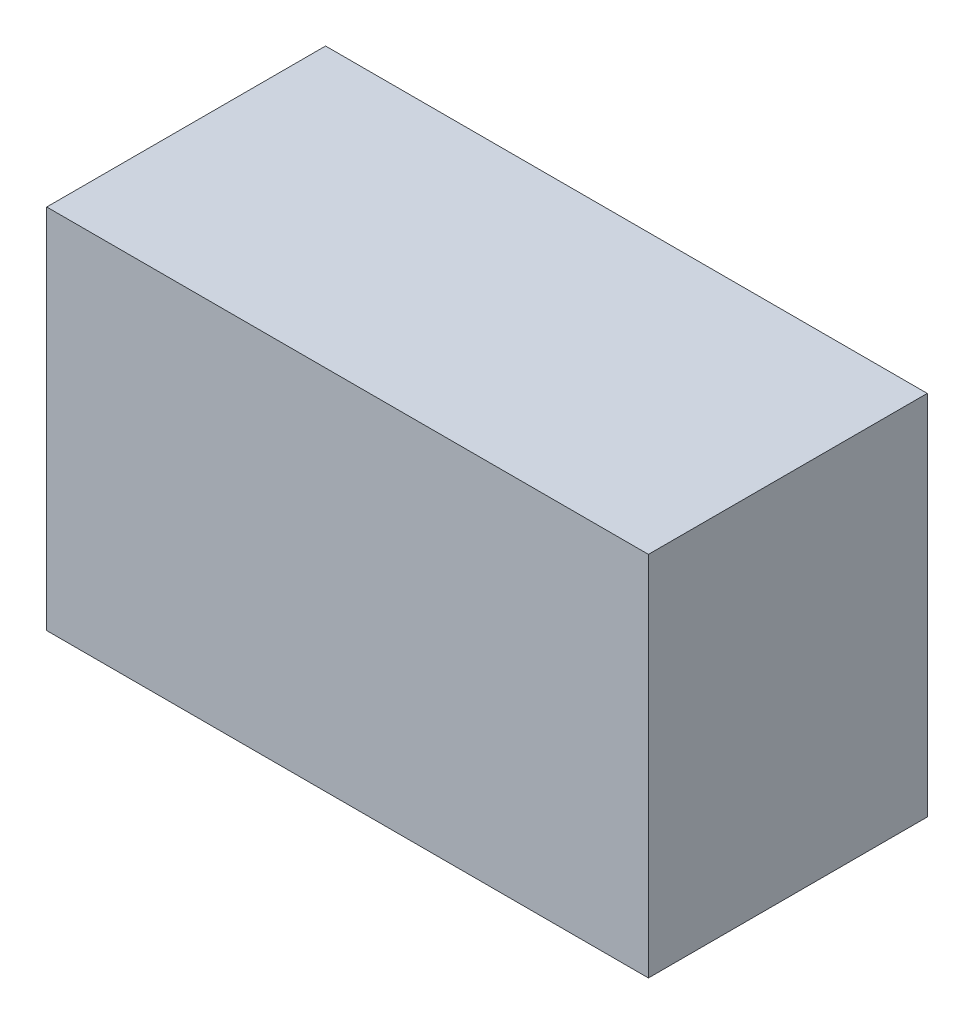
ISO-10303-21;
HEADER;
FILE_DESCRIPTION(('STEP AP214'),'2;1');
FILE_NAME('part.step','',(''),(''),'','','');
FILE_SCHEMA(('AUTOMOTIVE_DESIGN { 1 0 10303 214 1 1 1 1 }'));
ENDSEC;
DATA;
#1=APPLICATION_CONTEXT('core data for automotive mechanical design processes');
#2=APPLICATION_PROTOCOL_DEFINITION('international standard','automotive_design',2000,#1);
#3=PRODUCT_CONTEXT('',#1,'mechanical');
#4=PRODUCT('Part','Part','',(#3));
#5=PRODUCT_RELATED_PRODUCT_CATEGORY('part','',(#4));
#6=PRODUCT_DEFINITION_FORMATION('','',#4);
#7=PRODUCT_DEFINITION_CONTEXT('part definition',#1,'design');
#8=PRODUCT_DEFINITION('design','',#6,#7);
#9=PRODUCT_DEFINITION_SHAPE('','',#8);
#10=(LENGTH_UNIT() NAMED_UNIT(*) SI_UNIT(.MILLI.,.METRE.));
#11=(NAMED_UNIT(*) PLANE_ANGLE_UNIT() SI_UNIT($,.RADIAN.));
#12=(NAMED_UNIT(*) SI_UNIT($,.STERADIAN.) SOLID_ANGLE_UNIT());
#13=UNCERTAINTY_MEASURE_WITH_UNIT(LENGTH_MEASURE(1.E-05),#10,'distance_accuracy_value','');
#14=(GEOMETRIC_REPRESENTATION_CONTEXT(3) GLOBAL_UNCERTAINTY_ASSIGNED_CONTEXT((#13)) GLOBAL_UNIT_ASSIGNED_CONTEXT((#10,
#11,#12)) REPRESENTATION_CONTEXT('',''));
#15=CARTESIAN_POINT('',(0.,0.,0.));
#16=DIRECTION('',(0.,0.,1.));
#17=DIRECTION('',(1.,0.,0.));
#18=AXIS2_PLACEMENT_3D('',#15,#16,#17);
#19=CARTESIAN_POINT('',(20.5,12.5,19.));
#20=DIRECTION('',(-1.,0.,0.));
#21=DIRECTION('',(0.,-1.,0.));
#22=AXIS2_PLACEMENT_3D('',#19,#20,#21);
#23=PLANE('',#22);
#24=DIRECTION('',(0.,1.,0.));
#25=VECTOR('',#24,1.);
#26=CARTESIAN_POINT('',(20.5,12.5,0.));
#27=LINE('',#26,#25);
#28=CARTESIAN_POINT('',(20.5,-12.5,0.));
#29=VERTEX_POINT('',#28);
#30=CARTESIAN_POINT('',(20.5,12.5,0.));
#31=VERTEX_POINT('',#30);
#32=EDGE_CURVE('E98',#29,#31,#27,.T.);
#33=ORIENTED_EDGE('',*,*,#32,.T.);
#34=DIRECTION('',(0.,0.,-1.));
#35=VECTOR('',#34,1.);
#36=CARTESIAN_POINT('',(20.5,12.5,19.));
#37=LINE('',#36,#35);
#38=CARTESIAN_POINT('',(20.5,12.5,19.));
#39=VERTEX_POINT('',#38);
#40=EDGE_CURVE('E11',#39,#31,#37,.T.);
#41=ORIENTED_EDGE('',*,*,#40,.F.);
#42=DIRECTION('',(0.,1.,0.));
#43=VECTOR('',#42,1.);
#44=CARTESIAN_POINT('',(20.5,12.5,19.));
#45=LINE('',#44,#43);
#46=CARTESIAN_POINT('',(20.5,-12.5,19.));
#47=VERTEX_POINT('',#46);
#48=EDGE_CURVE('E86',#47,#39,#45,.T.);
#49=ORIENTED_EDGE('',*,*,#48,.F.);
#50=DIRECTION('',(0.,0.,-1.));
#51=VECTOR('',#50,1.);
#52=CARTESIAN_POINT('',(20.5,-12.5,19.));
#53=LINE('',#52,#51);
#54=EDGE_CURVE('E94',#47,#29,#53,.T.);
#55=ORIENTED_EDGE('',*,*,#54,.T.);
#56=EDGE_LOOP('',(#33,#41,#49,#55));
#57=FACE_BOUND('',#56,.T.);
#58=ADVANCED_FACE('F35',(#57),#23,.F.);
#59=CARTESIAN_POINT('',(-20.5,12.5,19.));
#60=DIRECTION('',(0.,-1.,0.));
#61=DIRECTION('',(0.,0.,-1.));
#62=AXIS2_PLACEMENT_3D('',#59,#60,#61);
#63=PLANE('',#62);
#64=DIRECTION('',(-1.,0.,0.));
#65=VECTOR('',#64,1.);
#66=CARTESIAN_POINT('',(-20.5,12.5,0.));
#67=LINE('',#66,#65);
#68=CARTESIAN_POINT('',(-20.5,12.5,0.));
#69=VERTEX_POINT('',#68);
#70=EDGE_CURVE('E90',#31,#69,#67,.T.);
#71=ORIENTED_EDGE('',*,*,#70,.T.);
#72=DIRECTION('',(0.,0.,-1.));
#73=VECTOR('',#72,1.);
#74=CARTESIAN_POINT('',(-20.5,12.5,19.));
#75=LINE('',#74,#73);
#76=CARTESIAN_POINT('',(-20.5,12.5,19.));
#77=VERTEX_POINT('',#76);
#78=EDGE_CURVE('E43',#77,#69,#75,.T.);
#79=ORIENTED_EDGE('',*,*,#78,.F.);
#80=DIRECTION('',(-1.,0.,0.));
#81=VECTOR('',#80,1.);
#82=CARTESIAN_POINT('',(-20.5,12.5,19.));
#83=LINE('',#82,#81);
#84=EDGE_CURVE('E81',#39,#77,#83,.T.);
#85=ORIENTED_EDGE('',*,*,#84,.F.);
#86=ORIENTED_EDGE('',*,*,#40,.T.);
#87=EDGE_LOOP('',(#71,#79,#85,#86));
#88=FACE_BOUND('',#87,.T.);
#89=ADVANCED_FACE('F89',(#88),#63,.F.);
#90=CARTESIAN_POINT('',(-20.5,12.5,19.));
#91=DIRECTION('',(1.,0.,0.));
#92=DIRECTION('',(0.,0.,-1.));
#93=AXIS2_PLACEMENT_3D('',#90,#91,#92);
#94=PLANE('',#93);
#95=DIRECTION('',(0.,-1.,0.));
#96=VECTOR('',#95,1.);
#97=CARTESIAN_POINT('',(-20.5,12.5,0.));
#98=LINE('',#97,#96);
#99=CARTESIAN_POINT('',(-20.5,-12.5,0.));
#100=VERTEX_POINT('',#99);
#101=EDGE_CURVE('E68',#69,#100,#98,.T.);
#102=ORIENTED_EDGE('',*,*,#101,.T.);
#103=DIRECTION('',(0.,0.,-1.));
#104=VECTOR('',#103,1.);
#105=CARTESIAN_POINT('',(-20.5,-12.5,19.));
#106=LINE('',#105,#104);
#107=CARTESIAN_POINT('',(-20.5,-12.5,19.));
#108=VERTEX_POINT('',#107);
#109=EDGE_CURVE('E91',#108,#100,#106,.T.);
#110=ORIENTED_EDGE('',*,*,#109,.F.);
#111=DIRECTION('',(0.,-1.,0.));
#112=VECTOR('',#111,1.);
#113=CARTESIAN_POINT('',(-20.5,12.5,19.));
#114=LINE('',#113,#112);
#115=EDGE_CURVE('E84',#77,#108,#114,.T.);
#116=ORIENTED_EDGE('',*,*,#115,.F.);
#117=ORIENTED_EDGE('',*,*,#78,.T.);
#118=EDGE_LOOP('',(#102,#110,#116,#117));
#119=FACE_BOUND('',#118,.T.);
#120=ADVANCED_FACE('F92',(#119),#94,.F.);
#121=CARTESIAN_POINT('',(-20.5,-12.5,19.));
#122=DIRECTION('',(0.,1.,0.));
#123=DIRECTION('',(0.,0.,1.));
#124=AXIS2_PLACEMENT_3D('',#121,#122,#123);
#125=PLANE('',#124);
#126=DIRECTION('',(1.,0.,0.));
#127=VECTOR('',#126,1.);
#128=CARTESIAN_POINT('',(-20.5,-12.5,0.));
#129=LINE('',#128,#127);
#130=EDGE_CURVE('E74',#100,#29,#129,.T.);
#131=ORIENTED_EDGE('',*,*,#130,.T.);
#132=ORIENTED_EDGE('',*,*,#54,.F.);
#133=DIRECTION('',(1.,0.,0.));
#134=VECTOR('',#133,1.);
#135=CARTESIAN_POINT('',(-20.5,-12.5,19.));
#136=LINE('',#135,#134);
#137=EDGE_CURVE('E51',#108,#47,#136,.T.);
#138=ORIENTED_EDGE('',*,*,#137,.F.);
#139=ORIENTED_EDGE('',*,*,#109,.T.);
#140=EDGE_LOOP('',(#131,#132,#138,#139));
#141=FACE_BOUND('',#140,.T.);
#142=ADVANCED_FACE('F105',(#141),#125,.F.);
#143=CARTESIAN_POINT('',(0.,0.,19.));
#144=DIRECTION('',(0.,0.,1.));
#145=DIRECTION('',(1.,0.,0.));
#146=AXIS2_PLACEMENT_3D('',#143,#144,#145);
#147=PLANE('',#146);
#148=ORIENTED_EDGE('',*,*,#48,.T.);
#149=ORIENTED_EDGE('',*,*,#84,.T.);
#150=ORIENTED_EDGE('',*,*,#115,.T.);
#151=ORIENTED_EDGE('',*,*,#137,.T.);
#152=EDGE_LOOP('',(#148,#149,#150,#151));
#153=FACE_BOUND('',#152,.T.);
#154=ADVANCED_FACE('F82',(#153),#147,.T.);
#155=CARTESIAN_POINT('',(0.,0.,0.));
#156=DIRECTION('',(0.,0.,1.));
#157=DIRECTION('',(1.,0.,0.));
#158=AXIS2_PLACEMENT_3D('',#155,#156,#157);
#159=PLANE('',#158);
#160=ORIENTED_EDGE('',*,*,#32,.F.);
#161=ORIENTED_EDGE('',*,*,#130,.F.);
#162=ORIENTED_EDGE('',*,*,#101,.F.);
#163=ORIENTED_EDGE('',*,*,#70,.F.);
#164=EDGE_LOOP('',(#160,#161,#162,#163));
#165=FACE_BOUND('',#164,.T.);
#166=ADVANCED_FACE('F108',(#165),#159,.F.);
#167=CLOSED_SHELL('',(#58,#89,#120,#142,#154,#166));
#168=MANIFOLD_SOLID_BREP('B2',#167);
#169=ADVANCED_BREP_SHAPE_REPRESENTATION('',(#18,#168),#14);
#170=SHAPE_DEFINITION_REPRESENTATION(#9,#169);
ENDSEC;
END-ISO-10303-21;
